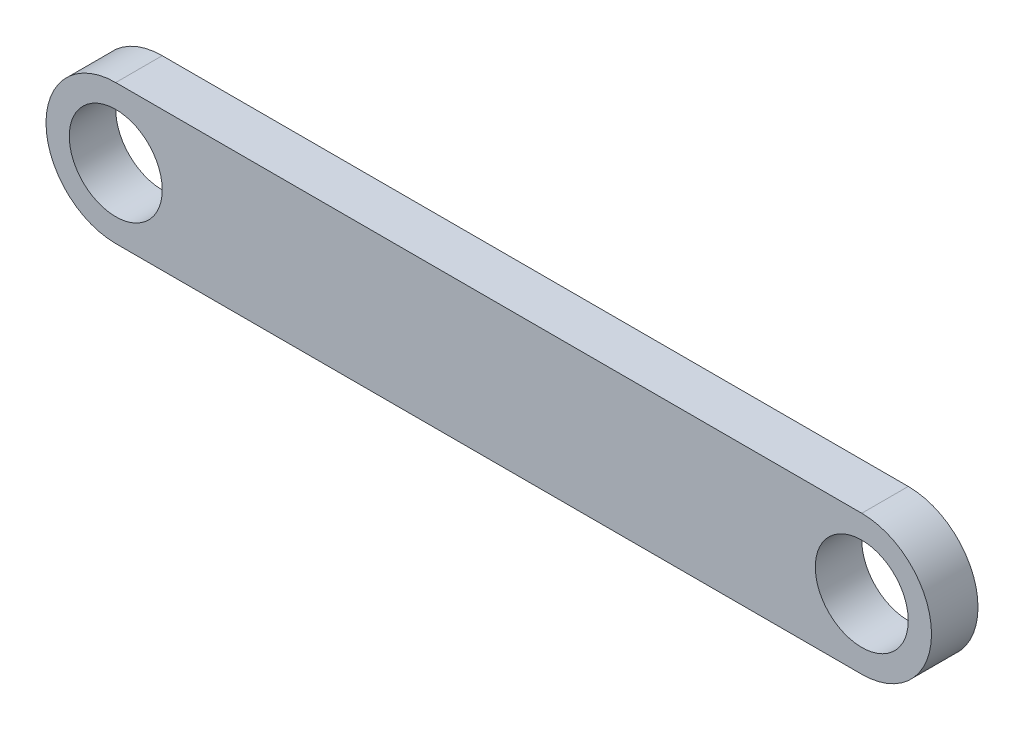
ISO-10303-21;
HEADER;
FILE_DESCRIPTION(('STEP AP214'),'2;1');
FILE_NAME('part.step','',(''),(''),'','','');
FILE_SCHEMA(('AUTOMOTIVE_DESIGN { 1 0 10303 214 1 1 1 1 }'));
ENDSEC;
DATA;
#1=APPLICATION_CONTEXT('core data for automotive mechanical design processes');
#2=APPLICATION_PROTOCOL_DEFINITION('international standard','automotive_design',2000,#1);
#3=PRODUCT_CONTEXT('',#1,'mechanical');
#4=PRODUCT('Part','Part','',(#3));
#5=PRODUCT_RELATED_PRODUCT_CATEGORY('part','',(#4));
#6=PRODUCT_DEFINITION_FORMATION('','',#4);
#7=PRODUCT_DEFINITION_CONTEXT('part definition',#1,'design');
#8=PRODUCT_DEFINITION('design','',#6,#7);
#9=PRODUCT_DEFINITION_SHAPE('','',#8);
#10=(LENGTH_UNIT() NAMED_UNIT(*) SI_UNIT(.MILLI.,.METRE.));
#11=(NAMED_UNIT(*) PLANE_ANGLE_UNIT() SI_UNIT($,.RADIAN.));
#12=(NAMED_UNIT(*) SI_UNIT($,.STERADIAN.) SOLID_ANGLE_UNIT());
#13=UNCERTAINTY_MEASURE_WITH_UNIT(LENGTH_MEASURE(1.E-05),#10,'distance_accuracy_value','');
#14=(GEOMETRIC_REPRESENTATION_CONTEXT(3) GLOBAL_UNCERTAINTY_ASSIGNED_CONTEXT((#13)) GLOBAL_UNIT_ASSIGNED_CONTEXT((#10,
#11,#12)) REPRESENTATION_CONTEXT('',''));
#15=CARTESIAN_POINT('',(0.,0.,0.));
#16=DIRECTION('',(0.,0.,1.));
#17=DIRECTION('',(1.,0.,0.));
#18=AXIS2_PLACEMENT_3D('',#15,#16,#17);
#19=CARTESIAN_POINT('',(0.,0.,0.5));
#20=DIRECTION('',(0.,0.,1.));
#21=DIRECTION('',(1.,0.,0.));
#22=AXIS2_PLACEMENT_3D('',#19,#20,#21);
#23=PLANE('',#22);
#24=CARTESIAN_POINT('',(-16.0465,0.,0.5));
#25=DIRECTION('',(0.,0.,1.));
#26=DIRECTION('',(1.,0.,0.));
#27=AXIS2_PLACEMENT_3D('',#24,#25,#26);
#28=CIRCLE('',#27,1.);
#29=CARTESIAN_POINT('',(-15.0465,0.,0.5));
#30=VERTEX_POINT('',#29);
#31=EDGE_CURVE('E102',#30,#30,#28,.T.);
#32=ORIENTED_EDGE('',*,*,#31,.F.);
#33=EDGE_LOOP('',(#32));
#34=FACE_BOUND('',#33,.T.);
#35=CARTESIAN_POINT('',(0.,0.,0.5));
#36=DIRECTION('',(0.,0.,1.));
#37=DIRECTION('',(1.,0.,0.));
#38=AXIS2_PLACEMENT_3D('',#35,#36,#37);
#39=CIRCLE('',#38,1.5);
#40=CARTESIAN_POINT('',(0.,-1.5,0.5));
#41=VERTEX_POINT('',#40);
#42=CARTESIAN_POINT('',(0.,1.5,0.5));
#43=VERTEX_POINT('',#42);
#44=EDGE_CURVE('E87',#41,#43,#39,.T.);
#45=ORIENTED_EDGE('',*,*,#44,.T.);
#46=DIRECTION('',(-1.,0.,0.));
#47=VECTOR('',#46,1.);
#48=CARTESIAN_POINT('',(0.,1.5,0.5));
#49=LINE('',#48,#47);
#50=CARTESIAN_POINT('',(-16.0465,1.5,0.5));
#51=VERTEX_POINT('',#50);
#52=EDGE_CURVE('E82',#43,#51,#49,.T.);
#53=ORIENTED_EDGE('',*,*,#52,.T.);
#54=CARTESIAN_POINT('',(-16.0465,0.,0.5));
#55=DIRECTION('',(0.,0.,1.));
#56=DIRECTION('',(1.,0.,0.));
#57=AXIS2_PLACEMENT_3D('',#54,#55,#56);
#58=CIRCLE('',#57,1.5);
#59=CARTESIAN_POINT('',(-16.0465,-1.5,0.5));
#60=VERTEX_POINT('',#59);
#61=EDGE_CURVE('E85',#51,#60,#58,.T.);
#62=ORIENTED_EDGE('',*,*,#61,.T.);
#63=DIRECTION('',(1.,0.,0.));
#64=VECTOR('',#63,1.);
#65=CARTESIAN_POINT('',(0.,-1.5,0.5));
#66=LINE('',#65,#64);
#67=EDGE_CURVE('E52',#60,#41,#66,.T.);
#68=ORIENTED_EDGE('',*,*,#67,.T.);
#69=EDGE_LOOP('',(#45,#53,#62,#68));
#70=FACE_BOUND('',#69,.T.);
#71=CARTESIAN_POINT('',(0.,0.,0.5));
#72=DIRECTION('',(0.,0.,1.));
#73=DIRECTION('',(1.,0.,0.));
#74=AXIS2_PLACEMENT_3D('',#71,#72,#73);
#75=CIRCLE('',#74,1.);
#76=CARTESIAN_POINT('',(1.,0.,0.5));
#77=VERTEX_POINT('',#76);
#78=EDGE_CURVE('E117',#77,#77,#75,.T.);
#79=ORIENTED_EDGE('',*,*,#78,.F.);
#80=EDGE_LOOP('',(#79));
#81=FACE_BOUND('',#80,.T.);
#82=ADVANCED_FACE('F35',(#34,#70,#81),#23,.T.);
#83=CARTESIAN_POINT('',(0.,0.,-0.5));
#84=DIRECTION('',(0.,0.,1.));
#85=DIRECTION('',(1.,0.,0.));
#86=AXIS2_PLACEMENT_3D('',#83,#84,#85);
#87=PLANE('',#86);
#88=CARTESIAN_POINT('',(0.,0.,-0.5));
#89=DIRECTION('',(0.,0.,1.));
#90=DIRECTION('',(1.,0.,0.));
#91=AXIS2_PLACEMENT_3D('',#88,#89,#90);
#92=CIRCLE('',#91,1.5);
#93=CARTESIAN_POINT('',(0.,-1.5,-0.5));
#94=VERTEX_POINT('',#93);
#95=CARTESIAN_POINT('',(0.,1.5,-0.5));
#96=VERTEX_POINT('',#95);
#97=EDGE_CURVE('E99',#94,#96,#92,.T.);
#98=ORIENTED_EDGE('',*,*,#97,.F.);
#99=DIRECTION('',(1.,0.,0.));
#100=VECTOR('',#99,1.);
#101=CARTESIAN_POINT('',(0.,-1.5,-0.5));
#102=LINE('',#101,#100);
#103=CARTESIAN_POINT('',(-16.0465,-1.5,-0.5));
#104=VERTEX_POINT('',#103);
#105=EDGE_CURVE('E75',#104,#94,#102,.T.);
#106=ORIENTED_EDGE('',*,*,#105,.F.);
#107=CARTESIAN_POINT('',(-16.0465,0.,-0.5));
#108=DIRECTION('',(0.,0.,1.));
#109=DIRECTION('',(1.,0.,0.));
#110=AXIS2_PLACEMENT_3D('',#107,#108,#109);
#111=CIRCLE('',#110,1.5);
#112=CARTESIAN_POINT('',(-16.0465,1.5,-0.5));
#113=VERTEX_POINT('',#112);
#114=EDGE_CURVE('E69',#113,#104,#111,.T.);
#115=ORIENTED_EDGE('',*,*,#114,.F.);
#116=DIRECTION('',(-1.,0.,0.));
#117=VECTOR('',#116,1.);
#118=CARTESIAN_POINT('',(0.,1.5,-0.5));
#119=LINE('',#118,#117);
#120=EDGE_CURVE('E91',#96,#113,#119,.T.);
#121=ORIENTED_EDGE('',*,*,#120,.F.);
#122=EDGE_LOOP('',(#98,#106,#115,#121));
#123=FACE_BOUND('',#122,.T.);
#124=CARTESIAN_POINT('',(-16.0465,0.,-0.5));
#125=DIRECTION('',(0.,0.,1.));
#126=DIRECTION('',(1.,0.,0.));
#127=AXIS2_PLACEMENT_3D('',#124,#125,#126);
#128=CIRCLE('',#127,1.);
#129=CARTESIAN_POINT('',(-15.0465,0.,-0.5));
#130=VERTEX_POINT('',#129);
#131=EDGE_CURVE('E114',#130,#130,#128,.T.);
#132=ORIENTED_EDGE('',*,*,#131,.T.);
#133=EDGE_LOOP('',(#132));
#134=FACE_BOUND('',#133,.T.);
#135=CARTESIAN_POINT('',(0.,0.,-0.5));
#136=DIRECTION('',(0.,0.,1.));
#137=DIRECTION('',(1.,0.,0.));
#138=AXIS2_PLACEMENT_3D('',#135,#136,#137);
#139=CIRCLE('',#138,1.);
#140=CARTESIAN_POINT('',(1.,0.,-0.5));
#141=VERTEX_POINT('',#140);
#142=EDGE_CURVE('E120',#141,#141,#139,.T.);
#143=ORIENTED_EDGE('',*,*,#142,.T.);
#144=EDGE_LOOP('',(#143));
#145=FACE_BOUND('',#144,.T.);
#146=ADVANCED_FACE('F110',(#123,#134,#145),#87,.F.);
#147=CARTESIAN_POINT('',(0.,0.,0.5));
#148=DIRECTION('',(0.,0.,-1.));
#149=DIRECTION('',(-1.,0.,0.));
#150=AXIS2_PLACEMENT_3D('',#147,#148,#149);
#151=CYLINDRICAL_SURFACE('',#150,1.5);
#152=ORIENTED_EDGE('',*,*,#97,.T.);
#153=DIRECTION('',(0.,0.,-1.));
#154=VECTOR('',#153,1.);
#155=CARTESIAN_POINT('',(0.,1.5,0.5));
#156=LINE('',#155,#154);
#157=EDGE_CURVE('E11',#43,#96,#156,.T.);
#158=ORIENTED_EDGE('',*,*,#157,.F.);
#159=ORIENTED_EDGE('',*,*,#44,.F.);
#160=DIRECTION('',(0.,0.,-1.));
#161=VECTOR('',#160,1.);
#162=CARTESIAN_POINT('',(0.,-1.5,0.5));
#163=LINE('',#162,#161);
#164=EDGE_CURVE('E95',#41,#94,#163,.T.);
#165=ORIENTED_EDGE('',*,*,#164,.T.);
#166=EDGE_LOOP('',(#152,#158,#159,#165));
#167=FACE_BOUND('',#166,.T.);
#168=ADVANCED_FACE('F37',(#167),#151,.T.);
#169=CARTESIAN_POINT('',(0.,1.5,0.5));
#170=DIRECTION('',(0.,-1.,0.));
#171=DIRECTION('',(1.,0.,0.));
#172=AXIS2_PLACEMENT_3D('',#169,#170,#171);
#173=PLANE('',#172);
#174=ORIENTED_EDGE('',*,*,#120,.T.);
#175=DIRECTION('',(0.,0.,-1.));
#176=VECTOR('',#175,1.);
#177=CARTESIAN_POINT('',(-16.0465,1.5,0.5));
#178=LINE('',#177,#176);
#179=EDGE_CURVE('E44',#51,#113,#178,.T.);
#180=ORIENTED_EDGE('',*,*,#179,.F.);
#181=ORIENTED_EDGE('',*,*,#52,.F.);
#182=ORIENTED_EDGE('',*,*,#157,.T.);
#183=EDGE_LOOP('',(#174,#180,#181,#182));
#184=FACE_BOUND('',#183,.T.);
#185=ADVANCED_FACE('F90',(#184),#173,.F.);
#186=CARTESIAN_POINT('',(-16.0465,0.,0.5));
#187=DIRECTION('',(0.,0.,-1.));
#188=DIRECTION('',(-1.,0.,0.));
#189=AXIS2_PLACEMENT_3D('',#186,#187,#188);
#190=CYLINDRICAL_SURFACE('',#189,1.5);
#191=ORIENTED_EDGE('',*,*,#114,.T.);
#192=DIRECTION('',(0.,0.,-1.));
#193=VECTOR('',#192,1.);
#194=CARTESIAN_POINT('',(-16.0465,-1.5,0.5));
#195=LINE('',#194,#193);
#196=EDGE_CURVE('E92',#60,#104,#195,.T.);
#197=ORIENTED_EDGE('',*,*,#196,.F.);
#198=ORIENTED_EDGE('',*,*,#61,.F.);
#199=ORIENTED_EDGE('',*,*,#179,.T.);
#200=EDGE_LOOP('',(#191,#197,#198,#199));
#201=FACE_BOUND('',#200,.T.);
#202=ADVANCED_FACE('F93',(#201),#190,.T.);
#203=CARTESIAN_POINT('',(0.,-1.5,0.5));
#204=DIRECTION('',(0.,1.,0.));
#205=DIRECTION('',(-1.,0.,0.));
#206=AXIS2_PLACEMENT_3D('',#203,#204,#205);
#207=PLANE('',#206);
#208=ORIENTED_EDGE('',*,*,#105,.T.);
#209=ORIENTED_EDGE('',*,*,#164,.F.);
#210=ORIENTED_EDGE('',*,*,#67,.F.);
#211=ORIENTED_EDGE('',*,*,#196,.T.);
#212=EDGE_LOOP('',(#208,#209,#210,#211));
#213=FACE_BOUND('',#212,.T.);
#214=ADVANCED_FACE('F107',(#213),#207,.F.);
#215=CARTESIAN_POINT('',(-16.0465,0.,0.5));
#216=DIRECTION('',(0.,0.,-1.));
#217=DIRECTION('',(-1.,0.,0.));
#218=AXIS2_PLACEMENT_3D('',#215,#216,#217);
#219=CYLINDRICAL_SURFACE('',#218,1.);
#220=ORIENTED_EDGE('',*,*,#31,.T.);
#221=EDGE_LOOP('',(#220));
#222=FACE_BOUND('',#221,.T.);
#223=ORIENTED_EDGE('',*,*,#131,.F.);
#224=EDGE_LOOP('',(#223));
#225=FACE_BOUND('',#224,.T.);
#226=ADVANCED_FACE('F137',(#222,#225),#219,.F.);
#227=CARTESIAN_POINT('',(0.,0.,0.5));
#228=DIRECTION('',(0.,0.,-1.));
#229=DIRECTION('',(-1.,0.,0.));
#230=AXIS2_PLACEMENT_3D('',#227,#228,#229);
#231=CYLINDRICAL_SURFACE('',#230,1.);
#232=ORIENTED_EDGE('',*,*,#78,.T.);
#233=EDGE_LOOP('',(#232));
#234=FACE_BOUND('',#233,.T.);
#235=ORIENTED_EDGE('',*,*,#142,.F.);
#236=EDGE_LOOP('',(#235));
#237=FACE_BOUND('',#236,.T.);
#238=ADVANCED_FACE('F126',(#234,#237),#231,.F.);
#239=CLOSED_SHELL('',(#82,#146,#168,#185,#202,#214,#226,#238));
#240=MANIFOLD_SOLID_BREP('B2',#239);
#241=ADVANCED_BREP_SHAPE_REPRESENTATION('',(#18,#240),#14);
#242=SHAPE_DEFINITION_REPRESENTATION(#9,#241);
ENDSEC;
END-ISO-10303-21;
